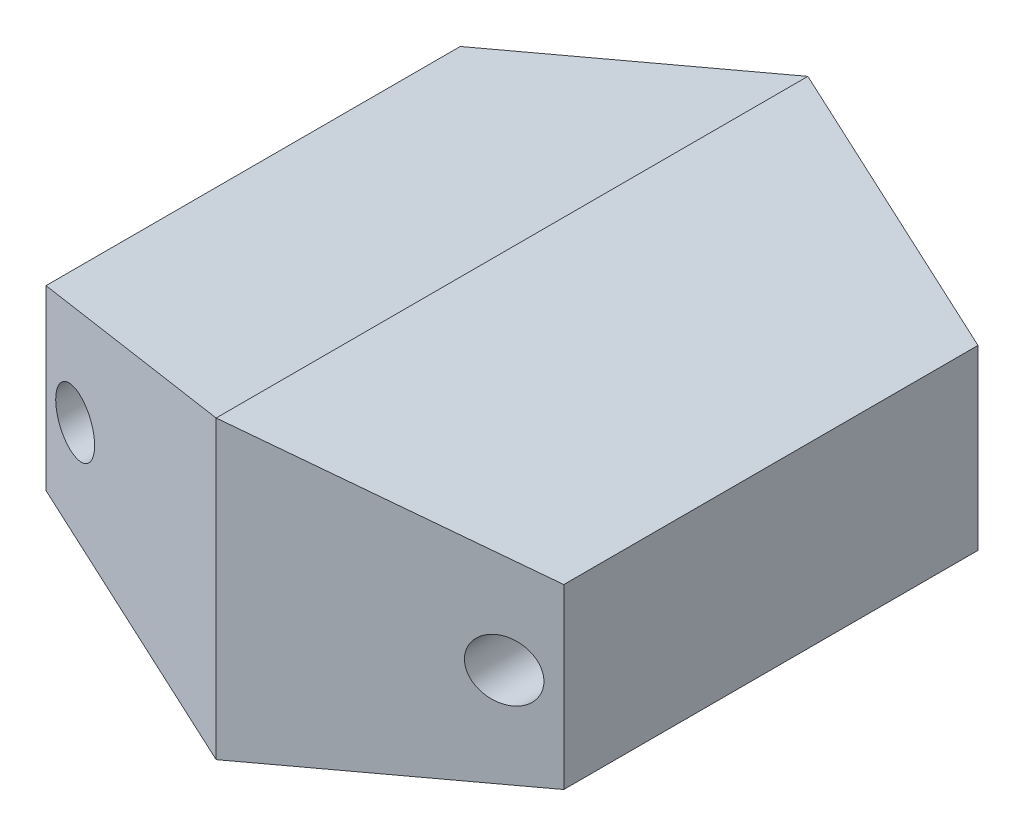
ISO-10303-21;
HEADER;
FILE_DESCRIPTION(('STEP AP214'),'2;1');
FILE_NAME('part.step','',(''),(''),'','','');
FILE_SCHEMA(('AUTOMOTIVE_DESIGN { 1 0 10303 214 1 1 1 1 }'));
ENDSEC;
DATA;
#1=APPLICATION_CONTEXT('core data for automotive mechanical design processes');
#2=APPLICATION_PROTOCOL_DEFINITION('international standard','automotive_design',2000,#1);
#3=PRODUCT_CONTEXT('',#1,'mechanical');
#4=PRODUCT('Part','Part','',(#3));
#5=PRODUCT_RELATED_PRODUCT_CATEGORY('part','',(#4));
#6=PRODUCT_DEFINITION_FORMATION('','',#4);
#7=PRODUCT_DEFINITION_CONTEXT('part definition',#1,'design');
#8=PRODUCT_DEFINITION('design','',#6,#7);
#9=PRODUCT_DEFINITION_SHAPE('','',#8);
#10=(LENGTH_UNIT() NAMED_UNIT(*) SI_UNIT(.MILLI.,.METRE.));
#11=(NAMED_UNIT(*) PLANE_ANGLE_UNIT() SI_UNIT($,.RADIAN.));
#12=(NAMED_UNIT(*) SI_UNIT($,.STERADIAN.) SOLID_ANGLE_UNIT());
#13=UNCERTAINTY_MEASURE_WITH_UNIT(LENGTH_MEASURE(1.E-05),#10,'distance_accuracy_value','');
#14=(GEOMETRIC_REPRESENTATION_CONTEXT(3) GLOBAL_UNCERTAINTY_ASSIGNED_CONTEXT((#13)) GLOBAL_UNIT_ASSIGNED_CONTEXT((#10,
#11,#12)) REPRESENTATION_CONTEXT('',''));
#15=CARTESIAN_POINT('',(0.,0.,0.));
#16=DIRECTION('',(0.,0.,1.));
#17=DIRECTION('',(1.,0.,0.));
#18=AXIS2_PLACEMENT_3D('',#15,#16,#17);
#19=CARTESIAN_POINT('',(17.5,-10.,40.));
#20=DIRECTION('',(-1.,0.,0.));
#21=DIRECTION('',(0.,0.,1.));
#22=AXIS2_PLACEMENT_3D('',#19,#20,#21);
#23=PLANE('',#22);
#24=DIRECTION('',(0.,0.,1.));
#25=VECTOR('',#24,1.);
#26=CARTESIAN_POINT('',(17.5,-6.,0.));
#27=LINE('',#26,#25);
#28=CARTESIAN_POINT('',(17.5,-6.,6.));
#29=VERTEX_POINT('',#28);
#30=CARTESIAN_POINT('',(17.5,-6.,34.));
#31=VERTEX_POINT('',#30);
#32=EDGE_CURVE('E238',#29,#31,#27,.T.);
#33=ORIENTED_EDGE('',*,*,#32,.F.);
#34=DIRECTION('',(0.,1.,0.));
#35=VECTOR('',#34,1.);
#36=CARTESIAN_POINT('',(17.5,-10.,6.));
#37=LINE('',#36,#35);
#38=CARTESIAN_POINT('',(17.5,6.,6.));
#39=VERTEX_POINT('',#38);
#40=EDGE_CURVE('E262',#29,#39,#37,.T.);
#41=ORIENTED_EDGE('',*,*,#40,.T.);
#42=DIRECTION('',(0.,0.,1.));
#43=VECTOR('',#42,1.);
#44=CARTESIAN_POINT('',(17.5,6.,0.));
#45=LINE('',#44,#43);
#46=CARTESIAN_POINT('',(17.5,6.,34.));
#47=VERTEX_POINT('',#46);
#48=EDGE_CURVE('E219',#39,#47,#45,.T.);
#49=ORIENTED_EDGE('',*,*,#48,.T.);
#50=DIRECTION('',(0.,1.,0.));
#51=VECTOR('',#50,1.);
#52=CARTESIAN_POINT('',(17.5,-10.,34.));
#53=LINE('',#52,#51);
#54=EDGE_CURVE('E261',#31,#47,#53,.T.);
#55=ORIENTED_EDGE('',*,*,#54,.F.);
#56=EDGE_LOOP('',(#33,#41,#49,#55));
#57=FACE_BOUND('',#56,.T.);
#58=ADVANCED_FACE('F147',(#57),#23,.F.);
#59=CARTESIAN_POINT('',(2.1722265321955,9.50349107835531,0.));
#60=DIRECTION('',(-0.222824801502141,-0.974858506571867,0.));
#61=DIRECTION('',(0.974858506571867,-0.222824801502141,0.));
#62=AXIS2_PLACEMENT_3D('',#59,#60,#61);
#63=PLANE('',#62);
#64=ORIENTED_EDGE('',*,*,#48,.F.);
#65=DIRECTION('',(-0.924580967307983,0.211332792527539,-0.316999188791308));
#66=VECTOR('',#65,1.);
#67=CARTESIAN_POINT('',(1.95394277739009,9.55338450802512,0.669923237962316));
#68=LINE('',#67,#66);
#69=CARTESIAN_POINT('',(0.,10.,0.));
#70=VERTEX_POINT('',#69);
#71=EDGE_CURVE('E204',#39,#70,#68,.T.);
#72=ORIENTED_EDGE('',*,*,#71,.T.);
#73=DIRECTION('',(0.,0.,1.));
#74=VECTOR('',#73,1.);
#75=CARTESIAN_POINT('',(0.,10.,0.));
#76=LINE('',#75,#74);
#77=CARTESIAN_POINT('',(0.,10.,40.));
#78=VERTEX_POINT('',#77);
#79=EDGE_CURVE('E217',#70,#78,#76,.T.);
#80=ORIENTED_EDGE('',*,*,#79,.T.);
#81=DIRECTION('',(-0.924580967307983,0.211332792527539,0.316999188791308));
#82=VECTOR('',#81,1.);
#83=CARTESIAN_POINT('',(13.6775994417306,6.87369155617586,35.3105373342638));
#84=LINE('',#83,#82);
#85=EDGE_CURVE('E171',#47,#78,#84,.T.);
#86=ORIENTED_EDGE('',*,*,#85,.F.);
#87=EDGE_LOOP('',(#64,#72,#80,#86));
#88=FACE_BOUND('',#87,.T.);
#89=ADVANCED_FACE('F215',(#88),#63,.F.);
#90=CARTESIAN_POINT('',(2.1722265321955,-9.50349107835532,0.));
#91=DIRECTION('',(-0.222824801502141,0.974858506571867,0.));
#92=DIRECTION('',(-0.974858506571867,-0.222824801502141,0.));
#93=AXIS2_PLACEMENT_3D('',#90,#91,#92);
#94=PLANE('',#93);
#95=DIRECTION('',(0.,0.,1.));
#96=VECTOR('',#95,1.);
#97=CARTESIAN_POINT('',(0.,-10.,0.));
#98=LINE('',#97,#96);
#99=CARTESIAN_POINT('',(0.,-10.,0.));
#100=VERTEX_POINT('',#99);
#101=CARTESIAN_POINT('',(0.,-10.,40.));
#102=VERTEX_POINT('',#101);
#103=EDGE_CURVE('E289',#100,#102,#98,.T.);
#104=ORIENTED_EDGE('',*,*,#103,.F.);
#105=DIRECTION('',(0.924580967307983,0.211332792527539,0.316999188791308));
#106=VECTOR('',#105,1.);
#107=CARTESIAN_POINT('',(1.95394277739009,-9.55338450802512,0.669923237962317));
#108=LINE('',#107,#106);
#109=EDGE_CURVE('E207',#100,#29,#108,.T.);
#110=ORIENTED_EDGE('',*,*,#109,.T.);
#111=ORIENTED_EDGE('',*,*,#32,.T.);
#112=DIRECTION('',(0.924580967307983,0.211332792527539,-0.316999188791308));
#113=VECTOR('',#112,1.);
#114=CARTESIAN_POINT('',(13.6775994417306,-6.87369155617586,35.3105373342638));
#115=LINE('',#114,#113);
#116=EDGE_CURVE('E221',#102,#31,#115,.T.);
#117=ORIENTED_EDGE('',*,*,#116,.F.);
#118=EDGE_LOOP('',(#104,#110,#111,#117));
#119=FACE_BOUND('',#118,.T.);
#120=ADVANCED_FACE('F299',(#119),#94,.F.);
#121=CARTESIAN_POINT('',(-17.5,-10.,40.));
#122=DIRECTION('',(1.,0.,0.));
#123=DIRECTION('',(0.,0.,-1.));
#124=AXIS2_PLACEMENT_3D('',#121,#122,#123);
#125=PLANE('',#124);
#126=DIRECTION('',(0.,1.,0.));
#127=VECTOR('',#126,1.);
#128=CARTESIAN_POINT('',(-17.5,-10.,6.));
#129=LINE('',#128,#127);
#130=CARTESIAN_POINT('',(-17.5,-6.,6.));
#131=VERTEX_POINT('',#130);
#132=CARTESIAN_POINT('',(-17.5,6.,6.));
#133=VERTEX_POINT('',#132);
#134=EDGE_CURVE('E163',#131,#133,#129,.T.);
#135=ORIENTED_EDGE('',*,*,#134,.F.);
#136=DIRECTION('',(0.,0.,1.));
#137=VECTOR('',#136,1.);
#138=CARTESIAN_POINT('',(-17.5,-6.,0.));
#139=LINE('',#138,#137);
#140=CARTESIAN_POINT('',(-17.5,-6.,34.));
#141=VERTEX_POINT('',#140);
#142=EDGE_CURVE('E235',#131,#141,#139,.T.);
#143=ORIENTED_EDGE('',*,*,#142,.T.);
#144=DIRECTION('',(0.,1.,0.));
#145=VECTOR('',#144,1.);
#146=CARTESIAN_POINT('',(-17.5,-10.,34.));
#147=LINE('',#146,#145);
#148=CARTESIAN_POINT('',(-17.5,6.,34.));
#149=VERTEX_POINT('',#148);
#150=EDGE_CURVE('E275',#141,#149,#147,.T.);
#151=ORIENTED_EDGE('',*,*,#150,.T.);
#152=DIRECTION('',(0.,0.,1.));
#153=VECTOR('',#152,1.);
#154=CARTESIAN_POINT('',(-17.5,6.,0.));
#155=LINE('',#154,#153);
#156=EDGE_CURVE('E230',#133,#149,#155,.T.);
#157=ORIENTED_EDGE('',*,*,#156,.F.);
#158=EDGE_LOOP('',(#135,#143,#151,#157));
#159=FACE_BOUND('',#158,.T.);
#160=ADVANCED_FACE('F309',(#159),#125,.F.);
#161=CARTESIAN_POINT('',(-2.1722265321955,-9.50349107835532,0.));
#162=DIRECTION('',(0.222824801502141,0.974858506571867,0.));
#163=DIRECTION('',(-0.974858506571867,0.222824801502141,0.));
#164=AXIS2_PLACEMENT_3D('',#161,#162,#163);
#165=PLANE('',#164);
#166=DIRECTION('',(-0.924580967307983,0.211332792527539,0.316999188791308));
#167=VECTOR('',#166,1.);
#168=CARTESIAN_POINT('',(-1.95394277739009,-9.55338450802512,0.669923237962317));
#169=LINE('',#168,#167);
#170=EDGE_CURVE('E285',#100,#131,#169,.T.);
#171=ORIENTED_EDGE('',*,*,#170,.F.);
#172=ORIENTED_EDGE('',*,*,#103,.T.);
#173=DIRECTION('',(-0.924580967307983,0.211332792527539,-0.316999188791308));
#174=VECTOR('',#173,1.);
#175=CARTESIAN_POINT('',(-13.6775994417306,-6.87369155617586,35.3105373342638));
#176=LINE('',#175,#174);
#177=EDGE_CURVE('E210',#102,#141,#176,.T.);
#178=ORIENTED_EDGE('',*,*,#177,.T.);
#179=ORIENTED_EDGE('',*,*,#142,.F.);
#180=EDGE_LOOP('',(#171,#172,#178,#179));
#181=FACE_BOUND('',#180,.T.);
#182=ADVANCED_FACE('F307',(#181),#165,.F.);
#183=CARTESIAN_POINT('',(-2.1722265321955,9.50349107835532,0.));
#184=DIRECTION('',(0.222824801502141,-0.974858506571867,0.));
#185=DIRECTION('',(0.974858506571867,0.222824801502141,0.));
#186=AXIS2_PLACEMENT_3D('',#183,#184,#185);
#187=PLANE('',#186);
#188=DIRECTION('',(0.924580967307983,0.211332792527539,-0.316999188791308));
#189=VECTOR('',#188,1.);
#190=CARTESIAN_POINT('',(-1.95394277739009,9.55338450802512,0.669923237962317));
#191=LINE('',#190,#189);
#192=EDGE_CURVE('E12',#133,#70,#191,.T.);
#193=ORIENTED_EDGE('',*,*,#192,.F.);
#194=ORIENTED_EDGE('',*,*,#156,.T.);
#195=DIRECTION('',(0.924580967307983,0.211332792527539,0.316999188791308));
#196=VECTOR('',#195,1.);
#197=CARTESIAN_POINT('',(-13.6775994417306,6.87369155617585,35.3105373342638));
#198=LINE('',#197,#196);
#199=EDGE_CURVE('E156',#149,#78,#198,.T.);
#200=ORIENTED_EDGE('',*,*,#199,.T.);
#201=ORIENTED_EDGE('',*,*,#79,.F.);
#202=EDGE_LOOP('',(#193,#194,#200,#201));
#203=FACE_BOUND('',#202,.T.);
#204=ADVANCED_FACE('F228',(#203),#187,.F.);
#205=CARTESIAN_POINT('',(-12.2717311906501,-10.,35.7925493060628));
#206=DIRECTION('',(0.324324324324324,0.,-0.945945945945946));
#207=DIRECTION('',(-0.945945945945946,0.,-0.324324324324324));
#208=AXIS2_PLACEMENT_3D('',#205,#206,#207);
#209=PLANE('',#208);
#210=CARTESIAN_POINT('',(-14.5,0.,35.0285714285714));
#211=DIRECTION('',(0.324324324324324,0.,-0.945945945945946));
#212=DIRECTION('',(-0.945945945945946,0.,-0.324324324324324));
#213=AXIS2_PLACEMENT_3D('',#210,#211,#212);
#214=ELLIPSE('',#213,2.11428571428571,2.);
#215=CARTESIAN_POINT('',(-16.5,0.,34.3428571428571));
#216=VERTEX_POINT('',#215);
#217=EDGE_CURVE('E256',#216,#216,#214,.F.);
#218=ORIENTED_EDGE('',*,*,#217,.F.);
#219=EDGE_LOOP('',(#218));
#220=FACE_BOUND('',#219,.T.);
#221=DIRECTION('',(0.,1.,0.));
#222=VECTOR('',#221,1.);
#223=CARTESIAN_POINT('',(0.,-10.,40.));
#224=LINE('',#223,#222);
#225=EDGE_CURVE('E265',#102,#78,#224,.T.);
#226=ORIENTED_EDGE('',*,*,#225,.T.);
#227=ORIENTED_EDGE('',*,*,#199,.F.);
#228=ORIENTED_EDGE('',*,*,#150,.F.);
#229=ORIENTED_EDGE('',*,*,#177,.F.);
#230=EDGE_LOOP('',(#226,#227,#228,#229));
#231=FACE_BOUND('',#230,.T.);
#232=ADVANCED_FACE('F305',(#220,#231),#209,.F.);
#233=CARTESIAN_POINT('',(0.,-10.,0.));
#234=DIRECTION('',(-0.324324324324324,0.,-0.945945945945946));
#235=DIRECTION('',(-0.945945945945946,0.,0.324324324324324));
#236=AXIS2_PLACEMENT_3D('',#233,#234,#235);
#237=PLANE('',#236);
#238=CARTESIAN_POINT('',(-14.5,0.,4.97142857142858));
#239=DIRECTION('',(-0.324324324324324,0.,-0.945945945945946));
#240=DIRECTION('',(0.945945945945946,0.,-0.324324324324324));
#241=AXIS2_PLACEMENT_3D('',#238,#239,#240);
#242=ELLIPSE('',#241,2.11428571428571,2.);
#243=CARTESIAN_POINT('',(-12.5,0.,4.28571428571429));
#244=VERTEX_POINT('',#243);
#245=EDGE_CURVE('E150',#244,#244,#242,.F.);
#246=ORIENTED_EDGE('',*,*,#245,.T.);
#247=EDGE_LOOP('',(#246));
#248=FACE_BOUND('',#247,.T.);
#249=ORIENTED_EDGE('',*,*,#170,.T.);
#250=ORIENTED_EDGE('',*,*,#134,.T.);
#251=ORIENTED_EDGE('',*,*,#192,.T.);
#252=DIRECTION('',(0.,1.,0.));
#253=VECTOR('',#252,1.);
#254=CARTESIAN_POINT('',(0.,-10.,0.));
#255=LINE('',#254,#253);
#256=EDGE_CURVE('E201',#100,#70,#255,.T.);
#257=ORIENTED_EDGE('',*,*,#256,.F.);
#258=EDGE_LOOP('',(#249,#250,#251,#257));
#259=FACE_BOUND('',#258,.T.);
#260=ADVANCED_FACE('F223',(#248,#259),#237,.T.);
#261=CARTESIAN_POINT('',(0.,-10.,0.));
#262=DIRECTION('',(-0.324324324324324,0.,0.945945945945946));
#263=DIRECTION('',(0.945945945945946,0.,0.324324324324324));
#264=AXIS2_PLACEMENT_3D('',#261,#262,#263);
#265=PLANE('',#264);
#266=CARTESIAN_POINT('',(14.5,0.,4.97142857142858));
#267=DIRECTION('',(-0.324324324324324,0.,0.945945945945946));
#268=DIRECTION('',(-0.945945945945946,0.,-0.324324324324324));
#269=AXIS2_PLACEMENT_3D('',#266,#267,#268);
#270=ELLIPSE('',#269,2.11428571428571,2.);
#271=CARTESIAN_POINT('',(12.5,0.,4.28571428571429));
#272=VERTEX_POINT('',#271);
#273=EDGE_CURVE('E246',#272,#272,#270,.F.);
#274=ORIENTED_EDGE('',*,*,#273,.F.);
#275=EDGE_LOOP('',(#274));
#276=FACE_BOUND('',#275,.T.);
#277=ORIENTED_EDGE('',*,*,#40,.F.);
#278=ORIENTED_EDGE('',*,*,#109,.F.);
#279=ORIENTED_EDGE('',*,*,#256,.T.);
#280=ORIENTED_EDGE('',*,*,#71,.F.);
#281=EDGE_LOOP('',(#277,#278,#279,#280));
#282=FACE_BOUND('',#281,.T.);
#283=ADVANCED_FACE('F203',(#276,#282),#265,.F.);
#284=CARTESIAN_POINT('',(12.2717311906501,-10.,35.7925493060628));
#285=DIRECTION('',(0.324324324324324,0.,0.945945945945946));
#286=DIRECTION('',(0.945945945945946,0.,-0.324324324324324));
#287=AXIS2_PLACEMENT_3D('',#284,#285,#286);
#288=PLANE('',#287);
#289=CARTESIAN_POINT('',(14.5,0.,35.0285714285714));
#290=DIRECTION('',(0.324324324324324,0.,0.945945945945946));
#291=DIRECTION('',(0.945945945945946,0.,-0.324324324324324));
#292=AXIS2_PLACEMENT_3D('',#289,#290,#291);
#293=ELLIPSE('',#292,2.11428571428571,2.);
#294=CARTESIAN_POINT('',(16.5,0.,34.3428571428571));
#295=VERTEX_POINT('',#294);
#296=EDGE_CURVE('E243',#295,#295,#293,.F.);
#297=ORIENTED_EDGE('',*,*,#296,.T.);
#298=EDGE_LOOP('',(#297));
#299=FACE_BOUND('',#298,.T.);
#300=ORIENTED_EDGE('',*,*,#85,.T.);
#301=ORIENTED_EDGE('',*,*,#225,.F.);
#302=ORIENTED_EDGE('',*,*,#116,.T.);
#303=ORIENTED_EDGE('',*,*,#54,.T.);
#304=EDGE_LOOP('',(#300,#301,#302,#303));
#305=FACE_BOUND('',#304,.T.);
#306=ADVANCED_FACE('F303',(#299,#305),#288,.T.);
#307=CARTESIAN_POINT('',(14.5,0.,40.));
#308=DIRECTION('',(0.,0.,-1.));
#309=DIRECTION('',(-1.,0.,0.));
#310=AXIS2_PLACEMENT_3D('',#307,#308,#309);
#311=CYLINDRICAL_SURFACE('',#310,2.);
#312=ORIENTED_EDGE('',*,*,#296,.F.);
#313=EDGE_LOOP('',(#312));
#314=FACE_BOUND('',#313,.T.);
#315=ORIENTED_EDGE('',*,*,#273,.T.);
#316=EDGE_LOOP('',(#315));
#317=FACE_BOUND('',#316,.T.);
#318=ADVANCED_FACE('F340',(#314,#317),#311,.F.);
#319=CARTESIAN_POINT('',(-14.5,0.,40.));
#320=DIRECTION('',(0.,0.,-1.));
#321=DIRECTION('',(-1.,0.,0.));
#322=AXIS2_PLACEMENT_3D('',#319,#320,#321);
#323=CYLINDRICAL_SURFACE('',#322,2.);
#324=ORIENTED_EDGE('',*,*,#245,.F.);
#325=EDGE_LOOP('',(#324));
#326=FACE_BOUND('',#325,.T.);
#327=ORIENTED_EDGE('',*,*,#217,.T.);
#328=EDGE_LOOP('',(#327));
#329=FACE_BOUND('',#328,.T.);
#330=ADVANCED_FACE('F338',(#326,#329),#323,.F.);
#331=CLOSED_SHELL('',(#58,#89,#120,#160,#182,#204,#232,#260,#283,#306,#318,#330));
#332=MANIFOLD_SOLID_BREP('B2',#331);
#333=ADVANCED_BREP_SHAPE_REPRESENTATION('',(#18,#332),#14);
#334=SHAPE_DEFINITION_REPRESENTATION(#9,#333);
ENDSEC;
END-ISO-10303-21;
